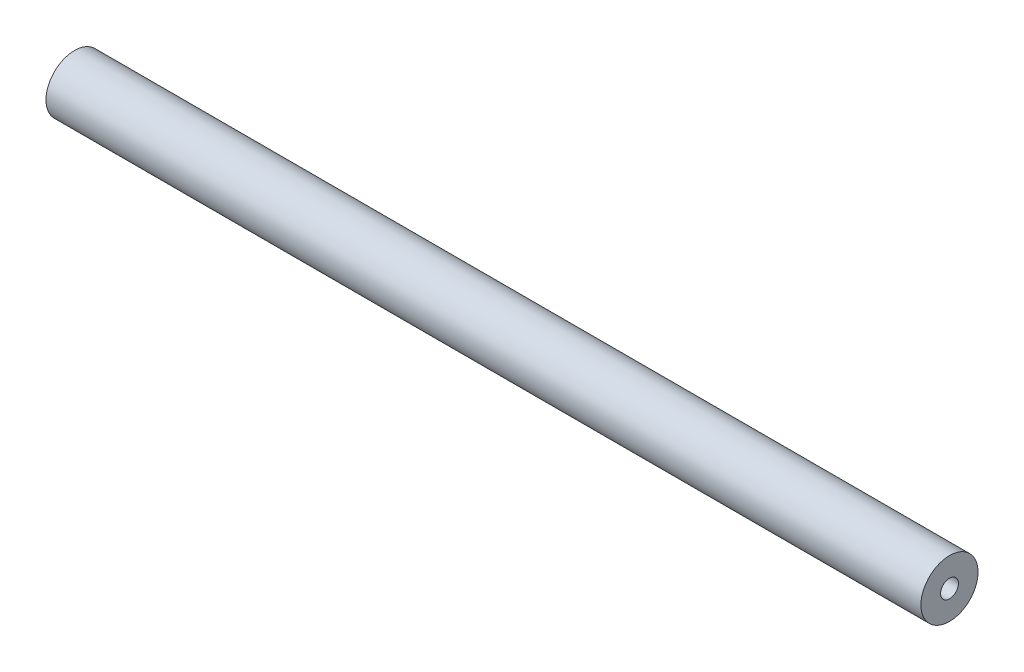
ISO-10303-21;
HEADER;
FILE_DESCRIPTION(('STEP AP214'),'2;1');
FILE_NAME('part.step','',(''),(''),'','','');
FILE_SCHEMA(('AUTOMOTIVE_DESIGN { 1 0 10303 214 1 1 1 1 }'));
ENDSEC;
DATA;
#1=APPLICATION_CONTEXT('core data for automotive mechanical design processes');
#2=APPLICATION_PROTOCOL_DEFINITION('international standard','automotive_design',2000,#1);
#3=PRODUCT_CONTEXT('',#1,'mechanical');
#4=PRODUCT('Part','Part','',(#3));
#5=PRODUCT_RELATED_PRODUCT_CATEGORY('part','',(#4));
#6=PRODUCT_DEFINITION_FORMATION('','',#4);
#7=PRODUCT_DEFINITION_CONTEXT('part definition',#1,'design');
#8=PRODUCT_DEFINITION('design','',#6,#7);
#9=PRODUCT_DEFINITION_SHAPE('','',#8);
#10=(LENGTH_UNIT() NAMED_UNIT(*) SI_UNIT(.MILLI.,.METRE.));
#11=(NAMED_UNIT(*) PLANE_ANGLE_UNIT() SI_UNIT($,.RADIAN.));
#12=(NAMED_UNIT(*) SI_UNIT($,.STERADIAN.) SOLID_ANGLE_UNIT());
#13=UNCERTAINTY_MEASURE_WITH_UNIT(LENGTH_MEASURE(1.E-05),#10,'distance_accuracy_value','');
#14=(GEOMETRIC_REPRESENTATION_CONTEXT(3) GLOBAL_UNCERTAINTY_ASSIGNED_CONTEXT((#13)) GLOBAL_UNIT_ASSIGNED_CONTEXT((#10,
#11,#12)) REPRESENTATION_CONTEXT('',''));
#15=CARTESIAN_POINT('',(0.,0.,0.));
#16=DIRECTION('',(0.,0.,1.));
#17=DIRECTION('',(1.,0.,0.));
#18=AXIS2_PLACEMENT_3D('',#15,#16,#17);
#19=CARTESIAN_POINT('',(72.5637084989848,0.,0.));
#20=DIRECTION('',(-1.,0.,0.));
#21=DIRECTION('',(0.,0.,1.));
#22=AXIS2_PLACEMENT_3D('',#19,#20,#21);
#23=CYLINDRICAL_SURFACE('',#22,4.);
#24=CARTESIAN_POINT('',(61.25,0.,0.));
#25=DIRECTION('',(1.,0.,0.));
#26=DIRECTION('',(0.,0.,-1.));
#27=AXIS2_PLACEMENT_3D('',#24,#25,#26);
#28=CIRCLE('',#27,4.);
#29=CARTESIAN_POINT('',(61.2500000000001,0.,4.));
#30=VERTEX_POINT('',#29);
#31=EDGE_CURVE('E11',#30,#30,#28,.T.);
#32=CARTESIAN_POINT('',(-61.25,0.,0.));
#33=DIRECTION('',(1.,0.,0.));
#34=DIRECTION('',(0.,0.,-1.));
#35=AXIS2_PLACEMENT_3D('',#32,#33,#34);
#36=CIRCLE('',#35,4.);
#37=CARTESIAN_POINT('',(-61.2500000000001,0.,4.));
#38=VERTEX_POINT('',#37);
#39=EDGE_CURVE('E61',#38,#38,#36,.T.);
#40=CARTESIAN_POINT('',(61.2500000000001,0.,4.));
#41=CARTESIAN_POINT('',(59.9739583333334,0.,4.));
#42=CARTESIAN_POINT('',(58.6979166666667,0.,4.));
#43=CARTESIAN_POINT('',(56.1458333333334,0.,4.));
#44=CARTESIAN_POINT('',(54.8697916666667,0.,4.));
#45=CARTESIAN_POINT('',(52.3177083333334,0.,4.));
#46=CARTESIAN_POINT('',(51.0416666666667,0.,4.));
#47=CARTESIAN_POINT('',(48.4895833333334,0.,4.));
#48=CARTESIAN_POINT('',(47.2135416666667,0.,4.));
#49=CARTESIAN_POINT('',(44.6614583333334,0.,4.));
#50=CARTESIAN_POINT('',(43.3854166666667,0.,4.));
#51=CARTESIAN_POINT('',(40.8333333333334,0.,4.));
#52=CARTESIAN_POINT('',(39.5572916666667,0.,4.));
#53=CARTESIAN_POINT('',(37.0052083333334,0.,4.));
#54=CARTESIAN_POINT('',(35.7291666666667,0.,4.));
#55=CARTESIAN_POINT('',(33.1770833333334,0.,4.));
#56=CARTESIAN_POINT('',(31.9010416666667,0.,4.));
#57=CARTESIAN_POINT('',(29.3489583333334,0.,4.));
#58=CARTESIAN_POINT('',(28.0729166666667,0.,4.));
#59=CARTESIAN_POINT('',(25.5208333333334,0.,4.));
#60=CARTESIAN_POINT('',(24.2447916666667,0.,4.));
#61=CARTESIAN_POINT('',(21.6927083333334,0.,4.));
#62=CARTESIAN_POINT('',(20.4166666666667,0.,4.));
#63=CARTESIAN_POINT('',(17.8645833333333,0.,4.));
#64=CARTESIAN_POINT('',(16.5885416666667,0.,4.));
#65=CARTESIAN_POINT('',(14.0364583333333,0.,4.));
#66=CARTESIAN_POINT('',(12.7604166666667,0.,4.));
#67=CARTESIAN_POINT('',(10.2083333333333,0.,4.));
#68=CARTESIAN_POINT('',(8.93229166666667,0.,4.));
#69=CARTESIAN_POINT('',(6.38020833333334,0.,4.));
#70=CARTESIAN_POINT('',(5.10416666666667,0.,4.));
#71=CARTESIAN_POINT('',(2.55208333333333,0.,4.));
#72=CARTESIAN_POINT('',(1.27604166666667,0.,4.));
#73=CARTESIAN_POINT('',(-1.27604166666667,0.,4.));
#74=CARTESIAN_POINT('',(-2.55208333333333,0.,4.));
#75=CARTESIAN_POINT('',(-5.10416666666667,0.,4.));
#76=CARTESIAN_POINT('',(-6.38020833333334,0.,4.));
#77=CARTESIAN_POINT('',(-8.93229166666667,0.,4.));
#78=CARTESIAN_POINT('',(-10.2083333333333,0.,4.));
#79=CARTESIAN_POINT('',(-12.7604166666667,0.,4.));
#80=CARTESIAN_POINT('',(-14.0364583333333,0.,4.));
#81=CARTESIAN_POINT('',(-16.5885416666667,0.,4.));
#82=CARTESIAN_POINT('',(-17.8645833333333,0.,4.));
#83=CARTESIAN_POINT('',(-20.4166666666667,0.,4.));
#84=CARTESIAN_POINT('',(-21.6927083333334,0.,4.));
#85=CARTESIAN_POINT('',(-24.2447916666667,0.,4.));
#86=CARTESIAN_POINT('',(-25.5208333333334,0.,4.));
#87=CARTESIAN_POINT('',(-28.0729166666667,0.,4.));
#88=CARTESIAN_POINT('',(-29.3489583333334,0.,4.));
#89=CARTESIAN_POINT('',(-31.9010416666667,0.,4.));
#90=CARTESIAN_POINT('',(-33.1770833333334,0.,4.));
#91=CARTESIAN_POINT('',(-35.7291666666667,0.,4.));
#92=CARTESIAN_POINT('',(-37.0052083333334,0.,4.));
#93=CARTESIAN_POINT('',(-39.5572916666667,0.,4.));
#94=CARTESIAN_POINT('',(-40.8333333333334,0.,4.));
#95=CARTESIAN_POINT('',(-43.3854166666667,0.,4.));
#96=CARTESIAN_POINT('',(-44.6614583333334,0.,4.));
#97=CARTESIAN_POINT('',(-47.2135416666667,0.,4.));
#98=CARTESIAN_POINT('',(-48.4895833333334,0.,4.));
#99=CARTESIAN_POINT('',(-51.0416666666667,0.,4.));
#100=CARTESIAN_POINT('',(-52.3177083333334,0.,4.));
#101=CARTESIAN_POINT('',(-54.8697916666667,0.,4.));
#102=CARTESIAN_POINT('',(-56.1458333333334,0.,4.));
#103=CARTESIAN_POINT('',(-58.6979166666667,0.,4.));
#104=CARTESIAN_POINT('',(-59.9739583333334,0.,4.));
#105=CARTESIAN_POINT('',(-61.2500000000001,0.,4.));
#106=B_SPLINE_CURVE_WITH_KNOTS('',3,(#40,#41,#42,#43,#44,#45,#46,#47,#48,#49,#50,#51,#52,#53,
#54,#55,#56,#57,#58,#59,#60,#61,#62,#63,#64,#65,#66,#67,#68,#69,#70,#71,#72,#73,#74,#75,#76,#77,
#78,#79,#80,#81,#82,#83,#84,#85,#86,#87,#88,#89,#90,#91,#92,#93,#94,#95,#96,#97,#98,#99,#100,
#101,#102,#103,#104,#105),.UNSPECIFIED.,.F.,.F.,(4,2,2,2,2,2,2,2,2,2,2,2,2,2,2,2,2,2,2,2,2,2,2,
2,2,2,2,2,2,2,2,2,4),(0.,3.82812500000001,7.65625000000001,11.484375,15.3125,19.140625,22.96875,
26.796875,30.625,34.453125,38.28125,42.109375,45.9375,49.765625,53.59375,57.421875,
61.2500000000001,65.0781250000001,68.9062500000001,72.7343750000001,76.5625000000001,
80.3906250000001,84.2187500000001,88.0468750000001,91.8750000000001,95.7031250000001,
99.5312500000001,103.359375,107.1875,111.015625,114.84375,118.671875,122.5),.UNSPECIFIED.);
#107=EDGE_CURVE('BSEAM37',#30,#38,#106,.T.);
#108=ORIENTED_EDGE('',*,*,#31,.F.);
#109=ORIENTED_EDGE('',*,*,#39,.T.);
#110=ORIENTED_EDGE('',*,*,#107,.T.);
#111=ORIENTED_EDGE('',*,*,#107,.F.);
#112=EDGE_LOOP('',(#108,#110,#109,#111));
#113=FACE_BOUND('',#112,.T.);
#114=ADVANCED_FACE('F37',(#113),#23,.T.);
#115=CARTESIAN_POINT('',(61.25,-32.8903696056034,-21.8041297494073));
#116=DIRECTION('',(1.,0.,0.));
#117=DIRECTION('',(0.,-0.945755465176162,0.324879362363049));
#118=AXIS2_PLACEMENT_3D('',#115,#116,#117);
#119=PLANE('',#118);
#120=CARTESIAN_POINT('',(61.25,0.,0.));
#121=DIRECTION('',(1.,0.,0.));
#122=DIRECTION('',(0.,0.,-1.));
#123=AXIS2_PLACEMENT_3D('',#120,#121,#122);
#124=CIRCLE('',#123,1.24999999999999);
#125=CARTESIAN_POINT('',(61.25,0.,-1.25000000000005));
#126=VERTEX_POINT('',#125);
#127=EDGE_CURVE('E65',#126,#126,#124,.T.);
#128=ORIENTED_EDGE('',*,*,#127,.F.);
#129=EDGE_LOOP('',(#128));
#130=FACE_BOUND('',#129,.T.);
#131=ORIENTED_EDGE('',*,*,#31,.T.);
#132=EDGE_LOOP('',(#131));
#133=FACE_BOUND('',#132,.T.);
#134=ADVANCED_FACE('F39',(#130,#133),#119,.T.);
#135=CARTESIAN_POINT('',(39.75,0.,0.));
#136=DIRECTION('',(1.,0.,0.));
#137=DIRECTION('',(0.,0.,-1.));
#138=AXIS2_PLACEMENT_3D('',#135,#136,#137);
#139=CONICAL_SURFACE('',#138,1.24999999999999,1.02974425867665);
#140=CARTESIAN_POINT('',(38.9989242262156,0.,0.));
#141=VERTEX_POINT('',#140);
#142=VERTEX_LOOP('',#141);
#143=FACE_BOUND('',#142,.T.);
#144=CARTESIAN_POINT('',(39.75,0.,0.));
#145=DIRECTION('',(1.,0.,0.));
#146=DIRECTION('',(0.,0.,-1.));
#147=AXIS2_PLACEMENT_3D('',#144,#145,#146);
#148=CIRCLE('',#147,1.24999999999999);
#149=CARTESIAN_POINT('',(39.75,0.,-1.25000000000005));
#150=VERTEX_POINT('',#149);
#151=EDGE_CURVE('E45',#150,#150,#148,.T.);
#152=ORIENTED_EDGE('',*,*,#151,.T.);
#153=EDGE_LOOP('',(#152));
#154=FACE_BOUND('',#153,.T.);
#155=ADVANCED_FACE('F74',(#143,#154),#139,.F.);
#156=CARTESIAN_POINT('',(61.25,0.,0.));
#157=DIRECTION('',(1.,0.,0.));
#158=DIRECTION('',(0.,0.,-1.));
#159=AXIS2_PLACEMENT_3D('',#156,#157,#158);
#160=CYLINDRICAL_SURFACE('',#159,1.24999999999999);
#161=ORIENTED_EDGE('',*,*,#151,.F.);
#162=EDGE_LOOP('',(#161));
#163=FACE_BOUND('',#162,.T.);
#164=ORIENTED_EDGE('',*,*,#127,.T.);
#165=EDGE_LOOP('',(#164));
#166=FACE_BOUND('',#165,.T.);
#167=ADVANCED_FACE('F76',(#163,#166),#160,.F.);
#168=CARTESIAN_POINT('',(-61.25,-32.8903696056034,-21.8041297494073));
#169=DIRECTION('',(-1.,0.,0.));
#170=DIRECTION('',(0.,-0.945755465176162,0.324879362363049));
#171=AXIS2_PLACEMENT_3D('',#168,#169,#170);
#172=PLANE('',#171);
#173=CARTESIAN_POINT('',(-61.25,0.,0.));
#174=DIRECTION('',(1.,0.,0.));
#175=DIRECTION('',(0.,0.,-1.));
#176=AXIS2_PLACEMENT_3D('',#173,#174,#175);
#177=CIRCLE('',#176,1.24999999999999);
#178=CARTESIAN_POINT('',(-61.25,0.,-1.25000000000005));
#179=VERTEX_POINT('',#178);
#180=EDGE_CURVE('E62',#179,#179,#177,.T.);
#181=ORIENTED_EDGE('',*,*,#180,.T.);
#182=EDGE_LOOP('',(#181));
#183=FACE_BOUND('',#182,.T.);
#184=ORIENTED_EDGE('',*,*,#39,.F.);
#185=EDGE_LOOP('',(#184));
#186=FACE_BOUND('',#185,.T.);
#187=ADVANCED_FACE('F55',(#183,#186),#172,.T.);
#188=CARTESIAN_POINT('',(-39.75,0.,0.));
#189=DIRECTION('',(-1.,0.,0.));
#190=DIRECTION('',(0.,0.,-1.));
#191=AXIS2_PLACEMENT_3D('',#188,#189,#190);
#192=CONICAL_SURFACE('',#191,1.24999999999999,1.02974425867665);
#193=CARTESIAN_POINT('',(-38.9989242262156,0.,0.));
#194=VERTEX_POINT('',#193);
#195=VERTEX_LOOP('',#194);
#196=FACE_BOUND('',#195,.T.);
#197=CARTESIAN_POINT('',(-39.75,0.,0.));
#198=DIRECTION('',(1.,0.,0.));
#199=DIRECTION('',(0.,0.,-1.));
#200=AXIS2_PLACEMENT_3D('',#197,#198,#199);
#201=CIRCLE('',#200,1.24999999999999);
#202=CARTESIAN_POINT('',(-39.75,0.,-1.25000000000005));
#203=VERTEX_POINT('',#202);
#204=EDGE_CURVE('E59',#203,#203,#201,.T.);
#205=ORIENTED_EDGE('',*,*,#204,.F.);
#206=EDGE_LOOP('',(#205));
#207=FACE_BOUND('',#206,.T.);
#208=ADVANCED_FACE('F51',(#196,#207),#192,.F.);
#209=CARTESIAN_POINT('',(-61.25,0.,0.));
#210=DIRECTION('',(-1.,0.,0.));
#211=DIRECTION('',(0.,0.,-1.));
#212=AXIS2_PLACEMENT_3D('',#209,#210,#211);
#213=CYLINDRICAL_SURFACE('',#212,1.24999999999999);
#214=ORIENTED_EDGE('',*,*,#204,.T.);
#215=EDGE_LOOP('',(#214));
#216=FACE_BOUND('',#215,.T.);
#217=ORIENTED_EDGE('',*,*,#180,.F.);
#218=EDGE_LOOP('',(#217));
#219=FACE_BOUND('',#218,.T.);
#220=ADVANCED_FACE('F54',(#216,#219),#213,.F.);
#221=CLOSED_SHELL('',(#114,#134,#155,#167,#187,#208,#220));
#222=MANIFOLD_SOLID_BREP('B2',#221);
#223=ADVANCED_BREP_SHAPE_REPRESENTATION('',(#18,#222),#14);
#224=SHAPE_DEFINITION_REPRESENTATION(#9,#223);
ENDSEC;
END-ISO-10303-21;
